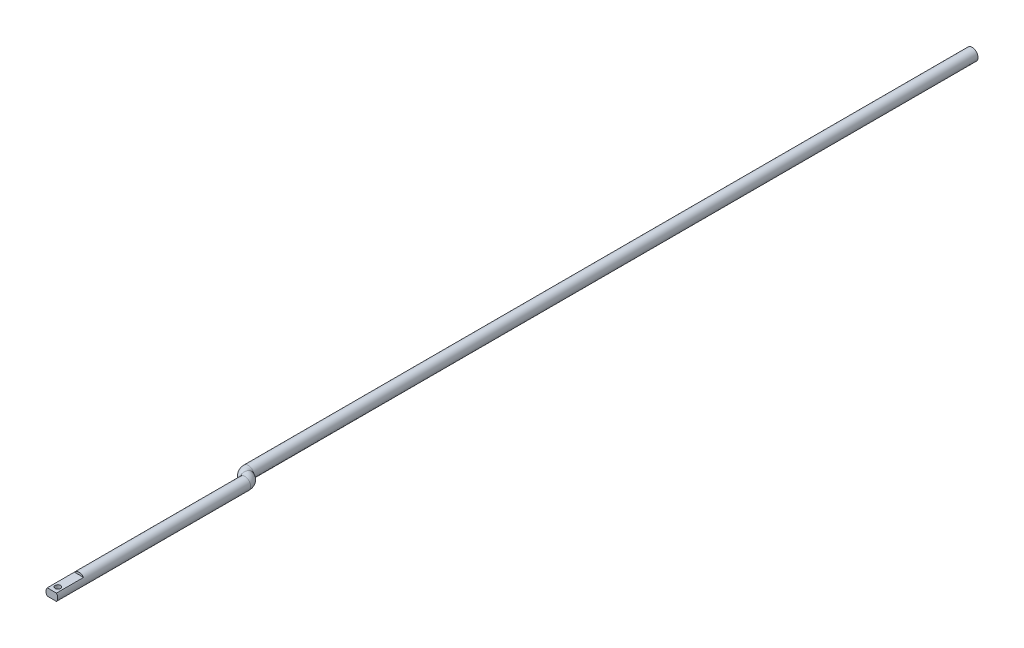
ISO-10303-21;
HEADER;
FILE_DESCRIPTION(('STEP AP214'),'2;1');
FILE_NAME('part.step','',(''),(''),'','','');
FILE_SCHEMA(('AUTOMOTIVE_DESIGN { 1 0 10303 214 1 1 1 1 }'));
ENDSEC;
DATA;
#1=APPLICATION_CONTEXT('core data for automotive mechanical design processes');
#2=APPLICATION_PROTOCOL_DEFINITION('international standard','automotive_design',2000,#1);
#3=PRODUCT_CONTEXT('',#1,'mechanical');
#4=PRODUCT('Part','Part','',(#3));
#5=PRODUCT_RELATED_PRODUCT_CATEGORY('part','',(#4));
#6=PRODUCT_DEFINITION_FORMATION('','',#4);
#7=PRODUCT_DEFINITION_CONTEXT('part definition',#1,'design');
#8=PRODUCT_DEFINITION('design','',#6,#7);
#9=PRODUCT_DEFINITION_SHAPE('','',#8);
#10=(LENGTH_UNIT() NAMED_UNIT(*) SI_UNIT(.MILLI.,.METRE.));
#11=(NAMED_UNIT(*) PLANE_ANGLE_UNIT() SI_UNIT($,.RADIAN.));
#12=(NAMED_UNIT(*) SI_UNIT($,.STERADIAN.) SOLID_ANGLE_UNIT());
#13=UNCERTAINTY_MEASURE_WITH_UNIT(LENGTH_MEASURE(1.E-05),#10,'distance_accuracy_value','');
#14=(GEOMETRIC_REPRESENTATION_CONTEXT(3) GLOBAL_UNCERTAINTY_ASSIGNED_CONTEXT((#13)) GLOBAL_UNIT_ASSIGNED_CONTEXT((#10,
#11,#12)) REPRESENTATION_CONTEXT('',''));
#15=CARTESIAN_POINT('',(0.,0.,0.));
#16=DIRECTION('',(0.,0.,1.));
#17=DIRECTION('',(1.,0.,0.));
#18=AXIS2_PLACEMENT_3D('',#15,#16,#17);
#19=CARTESIAN_POINT('',(0.,0.,-40.64));
#20=DIRECTION('',(0.,0.,1.));
#21=DIRECTION('',(1.,0.,0.));
#22=AXIS2_PLACEMENT_3D('',#19,#20,#21);
#23=CYLINDRICAL_SURFACE('',#22,1.2319);
#24=DIRECTION('',(0.,0.,1.));
#25=VECTOR('',#24,1.);
#26=CARTESIAN_POINT('',(0.967953309824396,-0.762,-40.64));
#27=LINE('',#26,#25);
#28=CARTESIAN_POINT('',(0.967953309824396,-0.762,0.));
#29=VERTEX_POINT('',#28);
#30=CARTESIAN_POINT('',(0.967953309824396,-0.762,-5.715));
#31=VERTEX_POINT('',#30);
#32=EDGE_CURVE('E90',#29,#31,#27,.F.);
#33=ORIENTED_EDGE('',*,*,#32,.T.);
#34=CARTESIAN_POINT('',(0.,0.,-5.715));
#35=DIRECTION('',(0.,0.,-1.));
#36=DIRECTION('',(-1.,0.,0.));
#37=AXIS2_PLACEMENT_3D('',#34,#35,#36);
#38=CIRCLE('',#37,1.2319);
#39=CARTESIAN_POINT('',(-0.967953309824396,-0.762,-5.715));
#40=VERTEX_POINT('',#39);
#41=EDGE_CURVE('E11',#40,#31,#38,.F.);
#42=ORIENTED_EDGE('',*,*,#41,.F.);
#43=DIRECTION('',(0.,0.,1.));
#44=VECTOR('',#43,1.);
#45=CARTESIAN_POINT('',(-0.967953309824396,-0.762,-40.64));
#46=LINE('',#45,#44);
#47=CARTESIAN_POINT('',(-0.967953309824396,-0.762,0.));
#48=VERTEX_POINT('',#47);
#49=EDGE_CURVE('E99',#40,#48,#46,.T.);
#50=ORIENTED_EDGE('',*,*,#49,.T.);
#51=CARTESIAN_POINT('',(0.,0.,0.));
#52=DIRECTION('',(0.,0.,1.));
#53=DIRECTION('',(1.,0.,0.));
#54=AXIS2_PLACEMENT_3D('',#51,#52,#53);
#55=CIRCLE('',#54,1.2319);
#56=CARTESIAN_POINT('',(-0.967953309824396,0.762,0.));
#57=VERTEX_POINT('',#56);
#58=EDGE_CURVE('E88',#57,#48,#55,.T.);
#59=ORIENTED_EDGE('',*,*,#58,.F.);
#60=DIRECTION('',(0.,0.,1.));
#61=VECTOR('',#60,1.);
#62=CARTESIAN_POINT('',(-0.967953309824396,0.762,-40.64));
#63=LINE('',#62,#61);
#64=CARTESIAN_POINT('',(-0.967953309824396,0.762,-5.715));
#65=VERTEX_POINT('',#64);
#66=EDGE_CURVE('E56',#57,#65,#63,.F.);
#67=ORIENTED_EDGE('',*,*,#66,.T.);
#68=CARTESIAN_POINT('',(0.967953309824396,0.762,-5.715));
#69=VERTEX_POINT('',#68);
#70=EDGE_CURVE('E41',#69,#65,#38,.F.);
#71=ORIENTED_EDGE('',*,*,#70,.F.);
#72=DIRECTION('',(0.,0.,1.));
#73=VECTOR('',#72,1.);
#74=CARTESIAN_POINT('',(0.967953309824396,0.762,-40.64));
#75=LINE('',#74,#73);
#76=CARTESIAN_POINT('',(0.967953309824396,0.762,0.));
#77=VERTEX_POINT('',#76);
#78=EDGE_CURVE('E75',#69,#77,#75,.T.);
#79=ORIENTED_EDGE('',*,*,#78,.T.);
#80=EDGE_CURVE('E48',#29,#77,#55,.T.);
#81=ORIENTED_EDGE('',*,*,#80,.F.);
#82=EDGE_LOOP('',(#33,#42,#50,#59,#67,#71,#79,#81));
#83=FACE_BOUND('',#82,.T.);
#84=CARTESIAN_POINT('',(0.,0.,-40.64));
#85=DIRECTION('',(0.,0.,-1.));
#86=DIRECTION('',(-1.,0.,0.));
#87=AXIS2_PLACEMENT_3D('',#84,#85,#86);
#88=CIRCLE('',#87,1.2319);
#89=CARTESIAN_POINT('',(1.2319,0.,-40.64));
#90=VERTEX_POINT('',#89);
#91=EDGE_CURVE('E110',#90,#90,#88,.T.);
#92=ORIENTED_EDGE('',*,*,#91,.F.);
#93=EDGE_LOOP('',(#92));
#94=FACE_BOUND('',#93,.T.);
#95=ADVANCED_FACE('F33',(#83,#94),#23,.T.);
#96=CARTESIAN_POINT('',(0.,0.,0.));
#97=DIRECTION('',(0.,0.,1.));
#98=DIRECTION('',(1.,0.,0.));
#99=AXIS2_PLACEMENT_3D('',#96,#97,#98);
#100=PLANE('',#99);
#101=ORIENTED_EDGE('',*,*,#58,.T.);
#102=DIRECTION('',(1.,0.,0.));
#103=VECTOR('',#102,1.);
#104=CARTESIAN_POINT('',(0.,-0.762,0.));
#105=LINE('',#104,#103);
#106=EDGE_CURVE('E79',#48,#29,#105,.T.);
#107=ORIENTED_EDGE('',*,*,#106,.T.);
#108=ORIENTED_EDGE('',*,*,#80,.T.);
#109=DIRECTION('',(-1.,0.,0.));
#110=VECTOR('',#109,1.);
#111=CARTESIAN_POINT('',(0.,0.762,0.));
#112=LINE('',#111,#110);
#113=EDGE_CURVE('E73',#77,#57,#112,.T.);
#114=ORIENTED_EDGE('',*,*,#113,.T.);
#115=EDGE_LOOP('',(#101,#107,#108,#114));
#116=FACE_BOUND('',#115,.T.);
#117=ADVANCED_FACE('F86',(#116),#100,.T.);
#118=CARTESIAN_POINT('',(-1.2319,0.762,-5.715));
#119=DIRECTION('',(0.,1.,0.));
#120=DIRECTION('',(0.,0.,1.));
#121=AXIS2_PLACEMENT_3D('',#118,#119,#120);
#122=PLANE('',#121);
#123=CARTESIAN_POINT('',(0.,0.762,-1.27));
#124=DIRECTION('',(0.,1.,0.));
#125=DIRECTION('',(0.,0.,1.));
#126=AXIS2_PLACEMENT_3D('',#123,#124,#125);
#127=CIRCLE('',#126,0.5715);
#128=CARTESIAN_POINT('',(0.,0.762,-0.6985));
#129=VERTEX_POINT('',#128);
#130=EDGE_CURVE('E104',#129,#129,#127,.T.);
#131=ORIENTED_EDGE('',*,*,#130,.F.);
#132=EDGE_LOOP('',(#131));
#133=FACE_BOUND('',#132,.T.);
#134=ORIENTED_EDGE('',*,*,#113,.F.);
#135=ORIENTED_EDGE('',*,*,#78,.F.);
#136=DIRECTION('',(-1.,0.,0.));
#137=VECTOR('',#136,1.);
#138=CARTESIAN_POINT('',(-1.2319,0.762,-5.715));
#139=LINE('',#138,#137);
#140=EDGE_CURVE('E96',#69,#65,#139,.T.);
#141=ORIENTED_EDGE('',*,*,#140,.T.);
#142=ORIENTED_EDGE('',*,*,#66,.F.);
#143=EDGE_LOOP('',(#134,#135,#141,#142));
#144=FACE_BOUND('',#143,.T.);
#145=ADVANCED_FACE('F74',(#133,#144),#122,.T.);
#146=CARTESIAN_POINT('',(0.,0.,-5.715));
#147=DIRECTION('',(0.,0.,-1.));
#148=DIRECTION('',(-1.,0.,0.));
#149=AXIS2_PLACEMENT_3D('',#146,#147,#148);
#150=PLANE('',#149);
#151=ORIENTED_EDGE('',*,*,#70,.T.);
#152=ORIENTED_EDGE('',*,*,#140,.F.);
#153=EDGE_LOOP('',(#151,#152));
#154=FACE_BOUND('',#153,.T.);
#155=ADVANCED_FACE('F95',(#154),#150,.F.);
#156=ORIENTED_EDGE('',*,*,#41,.T.);
#157=DIRECTION('',(1.,0.,0.));
#158=VECTOR('',#157,1.);
#159=CARTESIAN_POINT('',(-1.2319,-0.762,-5.715));
#160=LINE('',#159,#158);
#161=EDGE_CURVE('E83',#40,#31,#160,.T.);
#162=ORIENTED_EDGE('',*,*,#161,.F.);
#163=EDGE_LOOP('',(#156,#162));
#164=FACE_BOUND('',#163,.T.);
#165=ADVANCED_FACE('F151',(#164),#150,.F.);
#166=CARTESIAN_POINT('',(-1.2319,-0.762,-5.715));
#167=DIRECTION('',(0.,-1.,0.));
#168=DIRECTION('',(0.,0.,-1.));
#169=AXIS2_PLACEMENT_3D('',#166,#167,#168);
#170=PLANE('',#169);
#171=CARTESIAN_POINT('',(0.,-0.762,-1.27));
#172=DIRECTION('',(0.,-1.,0.));
#173=DIRECTION('',(0.,0.,-1.));
#174=AXIS2_PLACEMENT_3D('',#171,#172,#173);
#175=CIRCLE('',#174,0.5715);
#176=CARTESIAN_POINT('',(0.,-0.762,-1.8415));
#177=VERTEX_POINT('',#176);
#178=EDGE_CURVE('E36',#177,#177,#175,.T.);
#179=ORIENTED_EDGE('',*,*,#178,.F.);
#180=EDGE_LOOP('',(#179));
#181=FACE_BOUND('',#180,.T.);
#182=ORIENTED_EDGE('',*,*,#106,.F.);
#183=ORIENTED_EDGE('',*,*,#49,.F.);
#184=ORIENTED_EDGE('',*,*,#161,.T.);
#185=ORIENTED_EDGE('',*,*,#32,.F.);
#186=EDGE_LOOP('',(#182,#183,#184,#185));
#187=FACE_BOUND('',#186,.T.);
#188=ADVANCED_FACE('F153',(#181,#187),#170,.T.);
#189=CARTESIAN_POINT('',(0.,-1.2319,-1.27));
#190=DIRECTION('',(0.,1.,0.));
#191=DIRECTION('',(0.,0.,1.));
#192=AXIS2_PLACEMENT_3D('',#189,#190,#191);
#193=CYLINDRICAL_SURFACE('',#192,0.5715);
#194=ORIENTED_EDGE('',*,*,#178,.T.);
#195=EDGE_LOOP('',(#194));
#196=FACE_BOUND('',#195,.T.);
#197=ORIENTED_EDGE('',*,*,#130,.T.);
#198=EDGE_LOOP('',(#197));
#199=FACE_BOUND('',#198,.T.);
#200=ADVANCED_FACE('F137',(#196,#199),#193,.F.);
#201=CARTESIAN_POINT('',(-1.27,0.,-40.64));
#202=DIRECTION('',(0.,-1.,0.));
#203=DIRECTION('',(0.,0.,-1.));
#204=AXIS2_PLACEMENT_3D('',#201,#202,#203);
#205=TOROIDAL_SURFACE('',#204,1.27,1.2319);
#206=CARTESIAN_POINT('',(-0.835634417976405,0.,-41.8334096283981));
#207=DIRECTION('',(-0.939692620785909,0.,-0.342020143325666));
#208=DIRECTION('',(-0.342020143325666,0.,0.939692620785909));
#209=AXIS2_PLACEMENT_3D('',#206,#207,#208);
#210=CIRCLE('',#209,1.2319);
#211=CARTESIAN_POINT('',(-0.414299803413518,0.,-42.9910169679443));
#212=VERTEX_POINT('',#211);
#213=EDGE_CURVE('E107',#212,#212,#210,.T.);
#214=CARTESIAN_POINT('',(-1.27,0.,-40.64));
#215=DIRECTION('',(0.,-1.,0.));
#216=DIRECTION('',(0.,0.,-1.));
#217=AXIS2_PLACEMENT_3D('',#214,#215,#216);
#218=CIRCLE('',#217,2.5019);
#219=EDGE_CURVE('',#212,#90,#218,.T.);
#220=ORIENTED_EDGE('',*,*,#213,.F.);
#221=ORIENTED_EDGE('',*,*,#91,.T.);
#222=ORIENTED_EDGE('',*,*,#219,.T.);
#223=ORIENTED_EDGE('',*,*,#219,.F.);
#224=EDGE_LOOP('',(#220,#222,#221,#223));
#225=FACE_BOUND('',#224,.T.);
#226=ADVANCED_FACE('F131',(#225),#205,.T.);
#227=CARTESIAN_POINT('',(-0.40126883595281,0.,-43.0268192567962));
#228=DIRECTION('',(0.,1.,0.));
#229=DIRECTION('',(0.,0.,1.));
#230=AXIS2_PLACEMENT_3D('',#227,#228,#229);
#231=TOROIDAL_SURFACE('',#230,1.27,1.2319);
#232=CARTESIAN_POINT('',(-1.67126883595281,0.,-43.0268192567962));
#233=DIRECTION('',(0.,0.,-1.));
#234=DIRECTION('',(-1.,0.,0.));
#235=AXIS2_PLACEMENT_3D('',#232,#233,#234);
#236=CIRCLE('',#235,1.2319);
#237=CARTESIAN_POINT('',(-2.90316883595281,0.,-43.0268192567962));
#238=VERTEX_POINT('',#237);
#239=EDGE_CURVE('E113',#238,#238,#236,.T.);
#240=ORIENTED_EDGE('',*,*,#239,.F.);
#241=EDGE_LOOP('',(#240));
#242=FACE_BOUND('',#241,.T.);
#243=ORIENTED_EDGE('',*,*,#213,.T.);
#244=EDGE_LOOP('',(#243));
#245=FACE_BOUND('',#244,.T.);
#246=ADVANCED_FACE('F125',(#242,#245),#231,.T.);
#247=CARTESIAN_POINT('',(-1.67126883595281,0.,-195.426819256796));
#248=DIRECTION('',(0.,0.,1.));
#249=DIRECTION('',(1.,0.,0.));
#250=AXIS2_PLACEMENT_3D('',#247,#248,#249);
#251=CYLINDRICAL_SURFACE('',#250,1.2319);
#252=CARTESIAN_POINT('',(-1.67126883595281,0.,-195.426819256796));
#253=DIRECTION('',(0.,0.,-1.));
#254=DIRECTION('',(-1.,0.,0.));
#255=AXIS2_PLACEMENT_3D('',#252,#253,#254);
#256=CIRCLE('',#255,1.2319);
#257=CARTESIAN_POINT('',(-2.90316883595281,0.,-195.426819256796));
#258=VERTEX_POINT('',#257);
#259=EDGE_CURVE('E116',#258,#258,#256,.T.);
#260=ORIENTED_EDGE('',*,*,#259,.F.);
#261=EDGE_LOOP('',(#260));
#262=FACE_BOUND('',#261,.T.);
#263=ORIENTED_EDGE('',*,*,#239,.T.);
#264=EDGE_LOOP('',(#263));
#265=FACE_BOUND('',#264,.T.);
#266=ADVANCED_FACE('F122',(#262,#265),#251,.T.);
#267=CARTESIAN_POINT('',(-1.67126883595281,0.,-195.426819256796));
#268=DIRECTION('',(0.,0.,-1.));
#269=DIRECTION('',(-1.,0.,0.));
#270=AXIS2_PLACEMENT_3D('',#267,#268,#269);
#271=PLANE('',#270);
#272=ORIENTED_EDGE('',*,*,#259,.T.);
#273=EDGE_LOOP('',(#272));
#274=FACE_BOUND('',#273,.T.);
#275=ADVANCED_FACE('F120',(#274),#271,.T.);
#276=CLOSED_SHELL('',(#95,#117,#145,#155,#165,#188,#200,#226,#246,#266,#275));
#277=MANIFOLD_SOLID_BREP('B2',#276);
#278=ADVANCED_BREP_SHAPE_REPRESENTATION('',(#18,#277),#14);
#279=SHAPE_DEFINITION_REPRESENTATION(#9,#278);
ENDSEC;
END-ISO-10303-21;
